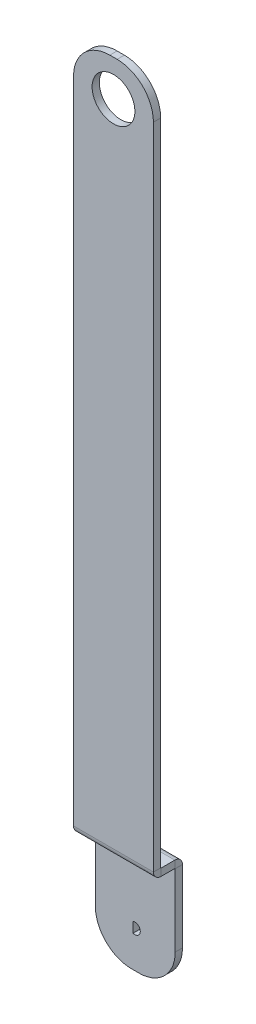
ISO-10303-21;
HEADER;
FILE_DESCRIPTION(('STEP AP214'),'2;1');
FILE_NAME('part.step','',(''),(''),'','','');
FILE_SCHEMA(('AUTOMOTIVE_DESIGN { 1 0 10303 214 1 1 1 1 }'));
ENDSEC;
DATA;
#1=APPLICATION_CONTEXT('core data for automotive mechanical design processes');
#2=APPLICATION_PROTOCOL_DEFINITION('international standard','automotive_design',2000,#1);
#3=PRODUCT_CONTEXT('',#1,'mechanical');
#4=PRODUCT('Part','Part','',(#3));
#5=PRODUCT_RELATED_PRODUCT_CATEGORY('part','',(#4));
#6=PRODUCT_DEFINITION_FORMATION('','',#4);
#7=PRODUCT_DEFINITION_CONTEXT('part definition',#1,'design');
#8=PRODUCT_DEFINITION('design','',#6,#7);
#9=PRODUCT_DEFINITION_SHAPE('','',#8);
#10=(LENGTH_UNIT() NAMED_UNIT(*) SI_UNIT(.MILLI.,.METRE.));
#11=(NAMED_UNIT(*) PLANE_ANGLE_UNIT() SI_UNIT($,.RADIAN.));
#12=(NAMED_UNIT(*) SI_UNIT($,.STERADIAN.) SOLID_ANGLE_UNIT());
#13=UNCERTAINTY_MEASURE_WITH_UNIT(LENGTH_MEASURE(1.E-05),#10,'distance_accuracy_value','');
#14=(GEOMETRIC_REPRESENTATION_CONTEXT(3) GLOBAL_UNCERTAINTY_ASSIGNED_CONTEXT((#13)) GLOBAL_UNIT_ASSIGNED_CONTEXT((#10,
#11,#12)) REPRESENTATION_CONTEXT('',''));
#15=CARTESIAN_POINT('',(0.,0.,0.));
#16=DIRECTION('',(0.,0.,1.));
#17=DIRECTION('',(1.,0.,0.));
#18=AXIS2_PLACEMENT_3D('',#15,#16,#17);
#19=CARTESIAN_POINT('',(-132.999999999779,-143.854999999984,0.0450000000203783));
#20=DIRECTION('',(1.,1.53185103490827E-12,1.85314263934089E-12));
#21=DIRECTION('',(1.53185103490827E-12,-1.,0.));
#22=AXIS2_PLACEMENT_3D('',#19,#20,#21);
#23=PLANE('',#22);
#24=DIRECTION('',(1.53185103490827E-12,-1.,0.));
#25=VECTOR('',#24,1.);
#26=CARTESIAN_POINT('',(-132.999999999779,-143.854999999984,0.0450000000203783));
#27=LINE('',#26,#25);
#28=CARTESIAN_POINT('',(-132.999999999779,-143.854999999984,0.0450000000203783));
#29=VERTEX_POINT('',#28);
#30=CARTESIAN_POINT('',(-132.999999999776,-145.854999999984,0.0450000000203783));
#31=VERTEX_POINT('',#30);
#32=EDGE_CURVE('E295',#29,#31,#27,.T.);
#33=ORIENTED_EDGE('',*,*,#32,.F.);
#34=CARTESIAN_POINT('',(-132.99999999978,-143.754999999984,0.0450000000203783));
#35=DIRECTION('',(-1.,-1.53185103490827E-12,-1.85314263934089E-12));
#36=DIRECTION('',(-1.53185103490827E-12,1.,0.));
#37=AXIS2_PLACEMENT_3D('',#34,#35,#36);
#38=CIRCLE('',#37,0.1);
#39=CARTESIAN_POINT('',(-132.99999999978,-143.754999999984,0.145000000020378));
#40=VERTEX_POINT('',#39);
#41=EDGE_CURVE('E201',#40,#29,#38,.F.);
#42=ORIENTED_EDGE('',*,*,#41,.F.);
#43=DIRECTION('',(1.85314263934081E-12,0.,-1.));
#44=VECTOR('',#43,1.);
#45=CARTESIAN_POINT('',(-132.999999999783,-143.754999999984,2.14500000002038));
#46=LINE('',#45,#44);
#47=CARTESIAN_POINT('',(-132.999999999783,-143.754999999984,2.14500000002038));
#48=VERTEX_POINT('',#47);
#49=EDGE_CURVE('E292',#48,#40,#46,.T.);
#50=ORIENTED_EDGE('',*,*,#49,.F.);
#51=CARTESIAN_POINT('',(-132.99999999978,-143.754999999984,0.0450000000203783));
#52=DIRECTION('',(1.,1.53185103490827E-12,1.85314263934089E-12));
#53=DIRECTION('',(1.53185103490827E-12,-1.,0.));
#54=AXIS2_PLACEMENT_3D('',#51,#52,#53);
#55=CIRCLE('',#54,2.1);
#56=EDGE_CURVE('E208',#48,#31,#55,.T.);
#57=ORIENTED_EDGE('',*,*,#56,.T.);
#58=EDGE_LOOP('',(#33,#42,#50,#57));
#59=FACE_BOUND('',#58,.T.);
#60=ADVANCED_FACE('F41',(#59),#23,.T.);
#61=CARTESIAN_POINT('',(-132.999999999783,-143.754999999984,2.14500000002038));
#62=DIRECTION('',(1.,1.53185103490827E-12,1.85314263934089E-12));
#63=DIRECTION('',(1.53185103490827E-12,-1.,0.));
#64=AXIS2_PLACEMENT_3D('',#61,#62,#63);
#65=PLANE('',#64);
#66=DIRECTION('',(1.85314263934089E-12,0.,-1.));
#67=VECTOR('',#66,1.);
#68=CARTESIAN_POINT('',(-132.99999999978,-143.854999999984,0.145000000020378));
#69=LINE('',#68,#67);
#70=CARTESIAN_POINT('',(-132.999999999772,-143.854999999984,-3.75499999997962));
#71=VERTEX_POINT('',#70);
#72=EDGE_CURVE('E198',#29,#71,#69,.T.);
#73=ORIENTED_EDGE('',*,*,#72,.F.);
#74=ORIENTED_EDGE('',*,*,#32,.T.);
#75=DIRECTION('',(1.85314263934089E-12,0.,-1.));
#76=VECTOR('',#75,1.);
#77=CARTESIAN_POINT('',(-132.999999999777,-145.854999999984,0.145000000020378));
#78=LINE('',#77,#76);
#79=CARTESIAN_POINT('',(-132.999999999769,-145.854999999984,-3.75499999997962));
#80=VERTEX_POINT('',#79);
#81=EDGE_CURVE('E211',#31,#80,#78,.T.);
#82=ORIENTED_EDGE('',*,*,#81,.T.);
#83=DIRECTION('',(-1.53185103490827E-12,1.,0.));
#84=VECTOR('',#83,1.);
#85=CARTESIAN_POINT('',(-132.999999999769,-145.854999999984,-3.75499999997962));
#86=LINE('',#85,#84);
#87=EDGE_CURVE('E283',#80,#71,#86,.T.);
#88=ORIENTED_EDGE('',*,*,#87,.T.);
#89=EDGE_LOOP('',(#73,#74,#82,#88));
#90=FACE_BOUND('',#89,.T.);
#91=ADVANCED_FACE('F370',(#90),#65,.T.);
#92=CARTESIAN_POINT('',(-154.99999999978,-143.755000000017,0.144999999979609));
#93=DIRECTION('',(-1.,-1.53185103490827E-12,-1.85314263934089E-12));
#94=DIRECTION('',(-1.53185103490827E-12,1.,0.));
#95=AXIS2_PLACEMENT_3D('',#92,#93,#94);
#96=PLANE('',#95);
#97=DIRECTION('',(-1.85314263934081E-12,0.,1.));
#98=VECTOR('',#97,1.);
#99=CARTESIAN_POINT('',(-154.99999999978,-143.755000000017,0.144999999979609));
#100=LINE('',#99,#98);
#101=CARTESIAN_POINT('',(-154.99999999978,-143.755000000017,0.144999999979609));
#102=VERTEX_POINT('',#101);
#103=CARTESIAN_POINT('',(-154.999999999784,-143.755000000018,2.14499999997961));
#104=VERTEX_POINT('',#103);
#105=EDGE_CURVE('E289',#102,#104,#100,.T.);
#106=ORIENTED_EDGE('',*,*,#105,.F.);
#107=CARTESIAN_POINT('',(-154.99999999978,-143.755000000017,0.0449999999796092));
#108=DIRECTION('',(-1.,-1.53185103490827E-12,-1.85314263934089E-12));
#109=DIRECTION('',(-1.53185103490827E-12,1.,0.));
#110=AXIS2_PLACEMENT_3D('',#107,#108,#109);
#111=CIRCLE('',#110,0.1);
#112=CARTESIAN_POINT('',(-154.999999999779,-143.855000000017,0.0449999999796092));
#113=VERTEX_POINT('',#112);
#114=EDGE_CURVE('E229',#102,#113,#111,.F.);
#115=ORIENTED_EDGE('',*,*,#114,.T.);
#116=DIRECTION('',(-1.53185103490827E-12,1.,0.));
#117=VECTOR('',#116,1.);
#118=CARTESIAN_POINT('',(-154.999999999776,-145.855000000017,0.0449999999796092));
#119=LINE('',#118,#117);
#120=CARTESIAN_POINT('',(-154.999999999776,-145.855000000017,0.0449999999796092));
#121=VERTEX_POINT('',#120);
#122=EDGE_CURVE('E287',#121,#113,#119,.T.);
#123=ORIENTED_EDGE('',*,*,#122,.F.);
#124=CARTESIAN_POINT('',(-154.99999999978,-143.755000000017,0.0449999999796092));
#125=DIRECTION('',(1.,1.53185103490827E-12,1.85314263934089E-12));
#126=DIRECTION('',(1.53185103490827E-12,-1.,0.));
#127=AXIS2_PLACEMENT_3D('',#124,#125,#126);
#128=CIRCLE('',#127,2.1);
#129=EDGE_CURVE('E236',#104,#121,#128,.T.);
#130=ORIENTED_EDGE('',*,*,#129,.F.);
#131=EDGE_LOOP('',(#106,#115,#123,#130));
#132=FACE_BOUND('',#131,.T.);
#133=ADVANCED_FACE('F428',(#132),#96,.T.);
#134=CARTESIAN_POINT('',(-154.999999999776,-145.855000000017,0.0449999999796092));
#135=DIRECTION('',(-1.,-1.53185103490827E-12,-1.85314263934089E-12));
#136=DIRECTION('',(-1.53185103490827E-12,1.,0.));
#137=AXIS2_PLACEMENT_3D('',#134,#135,#136);
#138=PLANE('',#137);
#139=DIRECTION('',(1.53185103490827E-12,-1.,0.));
#140=VECTOR('',#139,1.);
#141=CARTESIAN_POINT('',(-155.000000000073,45.1449999999826,2.14499999997961));
#142=LINE('',#141,#140);
#143=CARTESIAN_POINT('',(-155.000000000058,35.1449999999826,2.14499999997961));
#144=VERTEX_POINT('',#143);
#145=EDGE_CURVE('E234',#144,#104,#142,.T.);
#146=ORIENTED_EDGE('',*,*,#145,.F.);
#147=DIRECTION('',(1.85314263934089E-12,0.,-1.));
#148=VECTOR('',#147,1.);
#149=CARTESIAN_POINT('',(-155.000000000054,35.1449999999826,0.0449999999796092));
#150=LINE('',#149,#148);
#151=CARTESIAN_POINT('',(-155.000000000054,35.1449999999826,0.144999999979609));
#152=VERTEX_POINT('',#151);
#153=EDGE_CURVE('E315',#144,#152,#150,.T.);
#154=ORIENTED_EDGE('',*,*,#153,.T.);
#155=DIRECTION('',(1.53185103490827E-12,-1.,0.));
#156=VECTOR('',#155,1.);
#157=CARTESIAN_POINT('',(-155.000000000069,45.1449999999826,0.144999999979609));
#158=LINE('',#157,#156);
#159=EDGE_CURVE('E232',#152,#102,#158,.T.);
#160=ORIENTED_EDGE('',*,*,#159,.T.);
#161=ORIENTED_EDGE('',*,*,#105,.T.);
#162=EDGE_LOOP('',(#146,#154,#160,#161));
#163=FACE_BOUND('',#162,.T.);
#164=ADVANCED_FACE('F338',(#163),#138,.T.);
#165=CARTESIAN_POINT('',(-132.999999999765,-145.954999999984,-5.85499999997962));
#166=DIRECTION('',(1.,1.53185103490827E-12,1.85314263934089E-12));
#167=DIRECTION('',(1.53185103490827E-12,-1.,0.));
#168=AXIS2_PLACEMENT_3D('',#165,#166,#167);
#169=PLANE('',#168);
#170=DIRECTION('',(-1.85314263934089E-12,0.,1.));
#171=VECTOR('',#170,1.);
#172=CARTESIAN_POINT('',(-132.999999999765,-145.954999999984,-5.85499999997962));
#173=LINE('',#172,#171);
#174=CARTESIAN_POINT('',(-132.999999999765,-145.954999999984,-5.85499999997962));
#175=VERTEX_POINT('',#174);
#176=CARTESIAN_POINT('',(-132.999999999769,-145.954999999984,-3.85499999997962));
#177=VERTEX_POINT('',#176);
#178=EDGE_CURVE('E285',#175,#177,#173,.T.);
#179=ORIENTED_EDGE('',*,*,#178,.F.);
#180=CARTESIAN_POINT('',(-132.999999999769,-145.954999999984,-3.75499999997962));
#181=DIRECTION('',(1.,1.53185103490827E-12,1.85314263934089E-12));
#182=DIRECTION('',(1.53185103490827E-12,-1.,0.));
#183=AXIS2_PLACEMENT_3D('',#180,#181,#182);
#184=CIRCLE('',#183,2.1);
#185=EDGE_CURVE('E195',#71,#175,#184,.F.);
#186=ORIENTED_EDGE('',*,*,#185,.F.);
#187=ORIENTED_EDGE('',*,*,#87,.F.);
#188=CARTESIAN_POINT('',(-132.999999999769,-145.954999999984,-3.75499999997962));
#189=DIRECTION('',(1.,1.53185103490827E-12,1.85314263934089E-12));
#190=DIRECTION('',(1.53185103490827E-12,-1.,0.));
#191=AXIS2_PLACEMENT_3D('',#188,#189,#190);
#192=CIRCLE('',#191,0.0999999999999998);
#193=EDGE_CURVE('E214',#80,#177,#192,.F.);
#194=ORIENTED_EDGE('',*,*,#193,.T.);
#195=EDGE_LOOP('',(#179,#186,#187,#194));
#196=FACE_BOUND('',#195,.T.);
#197=ADVANCED_FACE('F379',(#196),#169,.T.);
#198=CARTESIAN_POINT('',(-132.999999999769,-145.854999999984,-3.75499999997962));
#199=DIRECTION('',(1.,1.53185103490827E-12,1.85314263934089E-12));
#200=DIRECTION('',(1.53185103490827E-12,-1.,0.));
#201=AXIS2_PLACEMENT_3D('',#198,#199,#200);
#202=PLANE('',#201);
#203=DIRECTION('',(1.53185103490827E-12,-1.,0.));
#204=VECTOR('',#203,1.);
#205=CARTESIAN_POINT('',(-132.999999999772,-143.854999999984,-3.85499999997962));
#206=LINE('',#205,#204);
#207=CARTESIAN_POINT('',(-132.999999999739,-165.854999999984,-3.85499999997962));
#208=VERTEX_POINT('',#207);
#209=EDGE_CURVE('E188',#177,#208,#206,.T.);
#210=ORIENTED_EDGE('',*,*,#209,.T.);
#211=DIRECTION('',(-1.85314263934089E-12,0.,1.));
#212=VECTOR('',#211,1.);
#213=CARTESIAN_POINT('',(-132.999999999739,-165.854999999984,-3.75499999997962));
#214=LINE('',#213,#212);
#215=CARTESIAN_POINT('',(-132.999999999735,-165.854999999984,-5.85499999997962));
#216=VERTEX_POINT('',#215);
#217=EDGE_CURVE('E306',#208,#216,#214,.F.);
#218=ORIENTED_EDGE('',*,*,#217,.T.);
#219=DIRECTION('',(1.53185103490827E-12,-1.,0.));
#220=VECTOR('',#219,1.);
#221=CARTESIAN_POINT('',(-132.999999999769,-143.854999999984,-5.85499999997962));
#222=LINE('',#221,#220);
#223=EDGE_CURVE('E191',#175,#216,#222,.T.);
#224=ORIENTED_EDGE('',*,*,#223,.F.);
#225=ORIENTED_EDGE('',*,*,#178,.T.);
#226=EDGE_LOOP('',(#210,#218,#224,#225));
#227=FACE_BOUND('',#226,.T.);
#228=ADVANCED_FACE('F387',(#227),#202,.T.);
#229=CARTESIAN_POINT('',(-154.999999999772,-143.855000000017,-3.75500000002039));
#230=DIRECTION('',(-1.,-1.53185103490827E-12,-1.85314263934089E-12));
#231=DIRECTION('',(-1.53185103490827E-12,1.,0.));
#232=AXIS2_PLACEMENT_3D('',#229,#230,#231);
#233=PLANE('',#232);
#234=DIRECTION('',(1.53185103490827E-12,-1.,0.));
#235=VECTOR('',#234,1.);
#236=CARTESIAN_POINT('',(-154.999999999772,-143.855000000017,-3.75500000002039));
#237=LINE('',#236,#235);
#238=CARTESIAN_POINT('',(-154.999999999772,-143.855000000017,-3.75500000002039));
#239=VERTEX_POINT('',#238);
#240=CARTESIAN_POINT('',(-154.999999999769,-145.855000000017,-3.75500000002039));
#241=VERTEX_POINT('',#240);
#242=EDGE_CURVE('E281',#239,#241,#237,.T.);
#243=ORIENTED_EDGE('',*,*,#242,.F.);
#244=CARTESIAN_POINT('',(-154.999999999769,-145.955000000017,-3.75500000002039));
#245=DIRECTION('',(1.,1.53185103490827E-12,1.85314263934089E-12));
#246=DIRECTION('',(1.53185103490827E-12,-1.,0.));
#247=AXIS2_PLACEMENT_3D('',#244,#245,#246);
#248=CIRCLE('',#247,2.1);
#249=CARTESIAN_POINT('',(-154.999999999765,-145.955000000017,-5.85500000002039));
#250=VERTEX_POINT('',#249);
#251=EDGE_CURVE('E223',#239,#250,#248,.F.);
#252=ORIENTED_EDGE('',*,*,#251,.T.);
#253=DIRECTION('',(1.85314263934089E-12,0.,-1.));
#254=VECTOR('',#253,1.);
#255=CARTESIAN_POINT('',(-154.999999999769,-145.955000000017,-3.85500000002039));
#256=LINE('',#255,#254);
#257=CARTESIAN_POINT('',(-154.999999999769,-145.955000000017,-3.85500000002039));
#258=VERTEX_POINT('',#257);
#259=EDGE_CURVE('E279',#258,#250,#256,.T.);
#260=ORIENTED_EDGE('',*,*,#259,.F.);
#261=CARTESIAN_POINT('',(-154.999999999769,-145.955000000017,-3.75500000002039));
#262=DIRECTION('',(1.,1.53185103490827E-12,1.85314263934089E-12));
#263=DIRECTION('',(1.53185103490827E-12,-1.,0.));
#264=AXIS2_PLACEMENT_3D('',#261,#262,#263);
#265=CIRCLE('',#264,0.0999999999999998);
#266=EDGE_CURVE('E192',#241,#258,#265,.F.);
#267=ORIENTED_EDGE('',*,*,#266,.F.);
#268=EDGE_LOOP('',(#243,#252,#260,#267));
#269=FACE_BOUND('',#268,.T.);
#270=ADVANCED_FACE('F407',(#269),#233,.T.);
#271=CARTESIAN_POINT('',(-154.999999999769,-145.955000000017,-3.85500000002039));
#272=DIRECTION('',(-1.,-1.53185103490827E-12,-1.85314263934089E-12));
#273=DIRECTION('',(-1.53185103490827E-12,1.,0.));
#274=AXIS2_PLACEMENT_3D('',#271,#272,#273);
#275=PLANE('',#274);
#276=DIRECTION('',(1.85314263934089E-12,0.,-1.));
#277=VECTOR('',#276,1.);
#278=CARTESIAN_POINT('',(-154.99999999978,-143.855000000017,0.144999999979609));
#279=LINE('',#278,#277);
#280=EDGE_CURVE('E226',#113,#239,#279,.T.);
#281=ORIENTED_EDGE('',*,*,#280,.T.);
#282=ORIENTED_EDGE('',*,*,#242,.T.);
#283=DIRECTION('',(1.85314263934089E-12,0.,-1.));
#284=VECTOR('',#283,1.);
#285=CARTESIAN_POINT('',(-154.999999999777,-145.855000000017,0.144999999979609));
#286=LINE('',#285,#284);
#287=EDGE_CURVE('E239',#121,#241,#286,.T.);
#288=ORIENTED_EDGE('',*,*,#287,.F.);
#289=ORIENTED_EDGE('',*,*,#122,.T.);
#290=EDGE_LOOP('',(#281,#282,#288,#289));
#291=FACE_BOUND('',#290,.T.);
#292=ADVANCED_FACE('F413',(#291),#275,.T.);
#293=CARTESIAN_POINT('',(-132.999999999772,-143.854999999984,-3.85499999997962));
#294=DIRECTION('',(1.85314263934089E-12,0.,-1.));
#295=DIRECTION('',(1.,1.53185103490827E-12,1.85314263934089E-12));
#296=AXIS2_PLACEMENT_3D('',#293,#294,#295);
#297=PLANE('',#296);
#298=DIRECTION('',(-1.53185103490827E-12,1.,0.));
#299=VECTOR('',#298,1.);
#300=CARTESIAN_POINT('',(-144.616566495482,-143.855000000002,-3.85500000000115));
#301=LINE('',#300,#299);
#302=CARTESIAN_POINT('',(-144.616566495447,-167.152240304964,-3.85500000000115));
#303=VERTEX_POINT('',#302);
#304=CARTESIAN_POINT('',(-144.616566495451,-164.323813180218,-3.85500000000115));
#305=VERTEX_POINT('',#304);
#306=EDGE_CURVE('E184',#303,#305,#301,.T.);
#307=ORIENTED_EDGE('',*,*,#306,.T.);
#308=CARTESIAN_POINT('',(-144.116566495449,-165.73802674259,-3.85500000000022));
#309=DIRECTION('',(1.85314263934089E-12,0.,-1.));
#310=DIRECTION('',(1.,1.53185103490827E-12,1.85314263934089E-12));
#311=AXIS2_PLACEMENT_3D('',#308,#309,#310);
#312=CIRCLE('',#311,1.5);
#313=EDGE_CURVE('E165',#305,#303,#312,.T.);
#314=ORIENTED_EDGE('',*,*,#313,.T.);
#315=EDGE_LOOP('',(#307,#314));
#316=FACE_BOUND('',#315,.T.);
#317=DIRECTION('',(-1.,-1.53185103490827E-12,-1.85314263934089E-12));
#318=VECTOR('',#317,1.);
#319=CARTESIAN_POINT('',(-132.999999999723,-175.854999999984,-3.85499999997962));
#320=LINE('',#319,#318);
#321=CARTESIAN_POINT('',(-142.999999999723,-175.854999999999,-3.85499999999815));
#322=VERTEX_POINT('',#321);
#323=CARTESIAN_POINT('',(-144.999999999723,-175.855000000002,-3.85500000000186));
#324=VERTEX_POINT('',#323);
#325=EDGE_CURVE('E276',#322,#324,#320,.T.);
#326=ORIENTED_EDGE('',*,*,#325,.F.);
#327=CARTESIAN_POINT('',(-142.999999999739,-165.854999999999,-3.85499999999815));
#328=DIRECTION('',(1.85314263934089E-12,0.,-1.));
#329=DIRECTION('',(1.,1.53185103490827E-12,1.85314263934089E-12));
#330=AXIS2_PLACEMENT_3D('',#327,#328,#329);
#331=CIRCLE('',#330,10.);
#332=EDGE_CURVE('E304',#322,#208,#331,.F.);
#333=ORIENTED_EDGE('',*,*,#332,.T.);
#334=ORIENTED_EDGE('',*,*,#209,.F.);
#335=DIRECTION('',(-1.,-1.53185103490827E-12,-1.85314263934089E-12));
#336=VECTOR('',#335,1.);
#337=CARTESIAN_POINT('',(-132.999999999769,-145.954999999984,-3.85499999997962));
#338=LINE('',#337,#336);
#339=EDGE_CURVE('E217',#177,#258,#338,.T.);
#340=ORIENTED_EDGE('',*,*,#339,.T.);
#341=DIRECTION('',(1.53185103490827E-12,-1.,0.));
#342=VECTOR('',#341,1.);
#343=CARTESIAN_POINT('',(-154.999999999772,-143.855000000017,-3.85500000002039));
#344=LINE('',#343,#342);
#345=CARTESIAN_POINT('',(-154.999999999739,-165.855000000017,-3.85500000002039));
#346=VERTEX_POINT('',#345);
#347=EDGE_CURVE('E187',#258,#346,#344,.T.);
#348=ORIENTED_EDGE('',*,*,#347,.T.);
#349=CARTESIAN_POINT('',(-144.999999999739,-165.855000000002,-3.85500000000186));
#350=DIRECTION('',(1.85314263934089E-12,0.,-1.));
#351=DIRECTION('',(1.,1.53185103490827E-12,1.85314263934089E-12));
#352=AXIS2_PLACEMENT_3D('',#349,#350,#351);
#353=CIRCLE('',#352,10.);
#354=EDGE_CURVE('E302',#346,#324,#353,.F.);
#355=ORIENTED_EDGE('',*,*,#354,.T.);
#356=EDGE_LOOP('',(#326,#333,#334,#340,#348,#355));
#357=FACE_BOUND('',#356,.T.);
#358=ADVANCED_FACE('F411',(#316,#357),#297,.F.);
#359=CARTESIAN_POINT('',(-132.99999999972,-175.854999999984,-5.85499999997962));
#360=DIRECTION('',(1.53185103490827E-12,-1.,0.));
#361=DIRECTION('',(-1.,-1.53185103490827E-12,-1.85314263934089E-12));
#362=AXIS2_PLACEMENT_3D('',#359,#360,#361);
#363=PLANE('',#362);
#364=DIRECTION('',(-1.,-1.53185103490827E-12,-1.85314263934089E-12));
#365=VECTOR('',#364,1.);
#366=CARTESIAN_POINT('',(-132.99999999972,-175.854999999984,-5.85499999997962));
#367=LINE('',#366,#365);
#368=CARTESIAN_POINT('',(-142.999999999719,-175.854999999999,-5.85499999999815));
#369=VERTEX_POINT('',#368);
#370=CARTESIAN_POINT('',(-144.99999999972,-175.855000000002,-5.85500000000186));
#371=VERTEX_POINT('',#370);
#372=EDGE_CURVE('E273',#369,#371,#367,.T.);
#373=ORIENTED_EDGE('',*,*,#372,.F.);
#374=DIRECTION('',(-1.85314263934089E-12,0.,1.));
#375=VECTOR('',#374,1.);
#376=CARTESIAN_POINT('',(-142.999999999719,-175.854999999999,-5.85499999999815));
#377=LINE('',#376,#375);
#378=EDGE_CURVE('E299',#369,#322,#377,.T.);
#379=ORIENTED_EDGE('',*,*,#378,.T.);
#380=ORIENTED_EDGE('',*,*,#325,.T.);
#381=DIRECTION('',(-1.85314263934089E-12,0.,1.));
#382=VECTOR('',#381,1.);
#383=CARTESIAN_POINT('',(-144.99999999972,-175.855000000002,-5.85500000000186));
#384=LINE('',#383,#382);
#385=EDGE_CURVE('E297',#324,#371,#384,.F.);
#386=ORIENTED_EDGE('',*,*,#385,.T.);
#387=EDGE_LOOP('',(#373,#379,#380,#386));
#388=FACE_BOUND('',#387,.T.);
#389=ADVANCED_FACE('F396',(#388),#363,.T.);
#390=CARTESIAN_POINT('',(-132.999999999769,-143.854999999984,-5.85499999997962));
#391=DIRECTION('',(1.85314263934089E-12,0.,-1.));
#392=DIRECTION('',(1.,1.53185103490827E-12,1.85314263934089E-12));
#393=AXIS2_PLACEMENT_3D('',#390,#391,#392);
#394=PLANE('',#393);
#395=CARTESIAN_POINT('',(-144.116566495445,-165.73802674259,-5.85500000000022));
#396=DIRECTION('',(1.85314263934089E-12,0.,-1.));
#397=DIRECTION('',(1.,1.53185103490827E-12,1.85314263934089E-12));
#398=AXIS2_PLACEMENT_3D('',#395,#396,#397);
#399=CIRCLE('',#398,1.5);
#400=CARTESIAN_POINT('',(-144.616566495447,-164.323813180218,-5.85500000000115));
#401=VERTEX_POINT('',#400);
#402=CARTESIAN_POINT('',(-144.616566495443,-167.152240304964,-5.85500000000115));
#403=VERTEX_POINT('',#402);
#404=EDGE_CURVE('E63',#401,#403,#399,.T.);
#405=ORIENTED_EDGE('',*,*,#404,.F.);
#406=DIRECTION('',(-1.53185103490827E-12,1.,0.));
#407=VECTOR('',#406,1.);
#408=CARTESIAN_POINT('',(-144.616566495447,-164.323813180218,-5.85500000000115));
#409=LINE('',#408,#407);
#410=EDGE_CURVE('E171',#403,#401,#409,.T.);
#411=ORIENTED_EDGE('',*,*,#410,.F.);
#412=EDGE_LOOP('',(#405,#411));
#413=FACE_BOUND('',#412,.T.);
#414=ORIENTED_EDGE('',*,*,#223,.T.);
#415=CARTESIAN_POINT('',(-142.999999999735,-165.854999999999,-5.85499999999815));
#416=DIRECTION('',(1.85314263934089E-12,0.,-1.));
#417=DIRECTION('',(1.,1.53185103490827E-12,1.85314263934089E-12));
#418=AXIS2_PLACEMENT_3D('',#415,#416,#417);
#419=CIRCLE('',#418,10.);
#420=EDGE_CURVE('E310',#216,#369,#419,.T.);
#421=ORIENTED_EDGE('',*,*,#420,.T.);
#422=ORIENTED_EDGE('',*,*,#372,.T.);
#423=CARTESIAN_POINT('',(-144.999999999735,-165.855000000002,-5.85500000000186));
#424=DIRECTION('',(1.85314263934089E-12,0.,-1.));
#425=DIRECTION('',(1.,1.53185103490827E-12,1.85314263934089E-12));
#426=AXIS2_PLACEMENT_3D('',#423,#424,#425);
#427=CIRCLE('',#426,10.);
#428=CARTESIAN_POINT('',(-154.999999999735,-165.855000000017,-5.85500000002039));
#429=VERTEX_POINT('',#428);
#430=EDGE_CURVE('E308',#371,#429,#427,.T.);
#431=ORIENTED_EDGE('',*,*,#430,.T.);
#432=DIRECTION('',(1.53185103490827E-12,-1.,0.));
#433=VECTOR('',#432,1.);
#434=CARTESIAN_POINT('',(-154.999999999769,-143.855000000017,-5.85500000002039));
#435=LINE('',#434,#433);
#436=EDGE_CURVE('E220',#250,#429,#435,.T.);
#437=ORIENTED_EDGE('',*,*,#436,.F.);
#438=DIRECTION('',(-1.,-1.53185103490827E-12,-1.85314263934089E-12));
#439=VECTOR('',#438,1.);
#440=CARTESIAN_POINT('',(-132.999999999765,-145.954999999984,-5.85499999997962));
#441=LINE('',#440,#439);
#442=EDGE_CURVE('E270',#175,#250,#441,.T.);
#443=ORIENTED_EDGE('',*,*,#442,.F.);
#444=EDGE_LOOP('',(#414,#421,#422,#431,#437,#443));
#445=FACE_BOUND('',#444,.T.);
#446=ADVANCED_FACE('F175',(#413,#445),#394,.T.);
#447=CARTESIAN_POINT('',(-132.999999999769,-145.954999999984,-3.75499999997962));
#448=DIRECTION('',(-1.,-1.53185103490827E-12,-1.85314263934089E-12));
#449=DIRECTION('',(-1.53185103490827E-12,1.,0.));
#450=AXIS2_PLACEMENT_3D('',#447,#448,#449);
#451=CYLINDRICAL_SURFACE('',#450,2.1);
#452=ORIENTED_EDGE('',*,*,#251,.F.);
#453=DIRECTION('',(-1.,-1.53185103490827E-12,-1.85314263934089E-12));
#454=VECTOR('',#453,1.);
#455=CARTESIAN_POINT('',(-132.999999999772,-143.854999999984,-3.75499999997962));
#456=LINE('',#455,#454);
#457=EDGE_CURVE('E267',#71,#239,#456,.T.);
#458=ORIENTED_EDGE('',*,*,#457,.F.);
#459=ORIENTED_EDGE('',*,*,#185,.T.);
#460=ORIENTED_EDGE('',*,*,#442,.T.);
#461=EDGE_LOOP('',(#452,#458,#459,#460));
#462=FACE_BOUND('',#461,.T.);
#463=ADVANCED_FACE('F378',(#462),#451,.T.);
#464=CARTESIAN_POINT('',(-132.99999999978,-143.854999999984,0.145000000020378));
#465=DIRECTION('',(-1.53185103490827E-12,1.,0.));
#466=DIRECTION('',(1.,1.53185103490827E-12,1.85314263934089E-12));
#467=AXIS2_PLACEMENT_3D('',#464,#465,#466);
#468=PLANE('',#467);
#469=ORIENTED_EDGE('',*,*,#280,.F.);
#470=DIRECTION('',(-1.,-1.53185103490827E-12,-1.85314263934089E-12));
#471=VECTOR('',#470,1.);
#472=CARTESIAN_POINT('',(-132.999999999779,-143.854999999984,0.0450000000203783));
#473=LINE('',#472,#471);
#474=EDGE_CURVE('E264',#29,#113,#473,.T.);
#475=ORIENTED_EDGE('',*,*,#474,.F.);
#476=ORIENTED_EDGE('',*,*,#72,.T.);
#477=ORIENTED_EDGE('',*,*,#457,.T.);
#478=EDGE_LOOP('',(#469,#475,#476,#477));
#479=FACE_BOUND('',#478,.T.);
#480=ADVANCED_FACE('F369',(#479),#468,.T.);
#481=CARTESIAN_POINT('',(-132.99999999978,-143.754999999984,0.0450000000203783));
#482=DIRECTION('',(-1.,-1.53185103490827E-12,-1.85314263934089E-12));
#483=DIRECTION('',(-1.53185103490827E-12,1.,0.));
#484=AXIS2_PLACEMENT_3D('',#481,#482,#483);
#485=CYLINDRICAL_SURFACE('',#484,0.1);
#486=ORIENTED_EDGE('',*,*,#114,.F.);
#487=DIRECTION('',(-1.,-1.53185103490827E-12,-1.85314263934089E-12));
#488=VECTOR('',#487,1.);
#489=CARTESIAN_POINT('',(-132.99999999978,-143.754999999984,0.145000000020378));
#490=LINE('',#489,#488);
#491=EDGE_CURVE('E261',#40,#102,#490,.T.);
#492=ORIENTED_EDGE('',*,*,#491,.F.);
#493=ORIENTED_EDGE('',*,*,#41,.T.);
#494=ORIENTED_EDGE('',*,*,#474,.T.);
#495=EDGE_LOOP('',(#486,#492,#493,#494));
#496=FACE_BOUND('',#495,.T.);
#497=ADVANCED_FACE('F361',(#496),#485,.F.);
#498=CARTESIAN_POINT('',(-133.000000000069,45.1450000000163,0.145000000020378));
#499=DIRECTION('',(1.85314263934089E-12,0.,-1.));
#500=DIRECTION('',(1.,1.53185103490827E-12,1.85314263934089E-12));
#501=AXIS2_PLACEMENT_3D('',#498,#499,#500);
#502=PLANE('',#501);
#503=CARTESIAN_POINT('',(-144.000000000054,35.1449999999994,0.144999999999994));
#504=DIRECTION('',(1.85314263934089E-12,0.,-1.));
#505=DIRECTION('',(1.,1.53185103490827E-12,1.85314263934089E-12));
#506=AXIS2_PLACEMENT_3D('',#503,#504,#505);
#507=CIRCLE('',#506,5.89418421464922);
#508=CARTESIAN_POINT('',(-138.105815785405,35.1450000000084,0.145000000010917));
#509=VERTEX_POINT('',#508);
#510=EDGE_CURVE('E181',#509,#509,#507,.T.);
#511=ORIENTED_EDGE('',*,*,#510,.F.);
#512=EDGE_LOOP('',(#511));
#513=FACE_BOUND('',#512,.T.);
#514=ORIENTED_EDGE('',*,*,#159,.F.);
#515=CARTESIAN_POINT('',(-145.000000000054,35.1449999999979,0.144999999998141));
#516=DIRECTION('',(1.85314263934089E-12,0.,-1.));
#517=DIRECTION('',(1.,1.53185103490827E-12,1.85314263934089E-12));
#518=AXIS2_PLACEMENT_3D('',#515,#516,#517);
#519=CIRCLE('',#518,10.);
#520=CARTESIAN_POINT('',(-145.000000000069,45.1449999999979,0.144999999998141));
#521=VERTEX_POINT('',#520);
#522=EDGE_CURVE('E320',#152,#521,#519,.T.);
#523=ORIENTED_EDGE('',*,*,#522,.T.);
#524=DIRECTION('',(-1.,-1.53185103490827E-12,-1.85314263934089E-12));
#525=VECTOR('',#524,1.);
#526=CARTESIAN_POINT('',(-133.000000000069,45.1450000000163,0.145000000020378));
#527=LINE('',#526,#525);
#528=CARTESIAN_POINT('',(-143.000000000069,45.145000000001,0.145000000001847));
#529=VERTEX_POINT('',#528);
#530=EDGE_CURVE('E258',#529,#521,#527,.T.);
#531=ORIENTED_EDGE('',*,*,#530,.F.);
#532=CARTESIAN_POINT('',(-143.000000000054,35.1450000000009,0.145000000001847));
#533=DIRECTION('',(1.85314263934089E-12,0.,-1.));
#534=DIRECTION('',(1.,1.53185103490827E-12,1.85314263934089E-12));
#535=AXIS2_PLACEMENT_3D('',#532,#533,#534);
#536=CIRCLE('',#535,10.);
#537=CARTESIAN_POINT('',(-133.000000000054,35.1450000000162,0.145000000020378));
#538=VERTEX_POINT('',#537);
#539=EDGE_CURVE('E318',#529,#538,#536,.T.);
#540=ORIENTED_EDGE('',*,*,#539,.T.);
#541=DIRECTION('',(1.53185103490827E-12,-1.,0.));
#542=VECTOR('',#541,1.);
#543=CARTESIAN_POINT('',(-133.000000000069,45.1450000000163,0.145000000020378));
#544=LINE('',#543,#542);
#545=EDGE_CURVE('E204',#538,#40,#544,.T.);
#546=ORIENTED_EDGE('',*,*,#545,.T.);
#547=ORIENTED_EDGE('',*,*,#491,.T.);
#548=EDGE_LOOP('',(#514,#523,#531,#540,#546,#547));
#549=FACE_BOUND('',#548,.T.);
#550=ADVANCED_FACE('F344',(#513,#549),#502,.T.);
#551=CARTESIAN_POINT('',(-133.000000000073,45.1450000000163,2.14500000002038));
#552=DIRECTION('',(-1.53185103490827E-12,1.,0.));
#553=DIRECTION('',(1.,1.53185103490827E-12,1.85314263934089E-12));
#554=AXIS2_PLACEMENT_3D('',#551,#552,#553);
#555=PLANE('',#554);
#556=ORIENTED_EDGE('',*,*,#530,.T.);
#557=DIRECTION('',(1.85314263934089E-12,0.,-1.));
#558=VECTOR('',#557,1.);
#559=CARTESIAN_POINT('',(-145.000000000073,45.1449999999979,2.14499999999814));
#560=LINE('',#559,#558);
#561=CARTESIAN_POINT('',(-145.000000000073,45.1449999999979,2.14499999999814));
#562=VERTEX_POINT('',#561);
#563=EDGE_CURVE('E325',#521,#562,#560,.F.);
#564=ORIENTED_EDGE('',*,*,#563,.T.);
#565=DIRECTION('',(-1.,-1.53185103490827E-12,-1.85314263934089E-12));
#566=VECTOR('',#565,1.);
#567=CARTESIAN_POINT('',(-133.000000000073,45.1450000000163,2.14500000002038));
#568=LINE('',#567,#566);
#569=CARTESIAN_POINT('',(-143.000000000073,45.145000000001,2.14500000000185));
#570=VERTEX_POINT('',#569);
#571=EDGE_CURVE('E255',#570,#562,#568,.T.);
#572=ORIENTED_EDGE('',*,*,#571,.F.);
#573=DIRECTION('',(1.85314263934089E-12,0.,-1.));
#574=VECTOR('',#573,1.);
#575=CARTESIAN_POINT('',(-143.000000000073,45.145000000001,2.14500000000185));
#576=LINE('',#575,#574);
#577=EDGE_CURVE('E322',#570,#529,#576,.T.);
#578=ORIENTED_EDGE('',*,*,#577,.T.);
#579=EDGE_LOOP('',(#556,#564,#572,#578));
#580=FACE_BOUND('',#579,.T.);
#581=ADVANCED_FACE('F346',(#580),#555,.T.);
#582=CARTESIAN_POINT('',(-133.000000000073,45.1450000000163,2.14500000002038));
#583=DIRECTION('',(1.85314263934089E-12,0.,-1.));
#584=DIRECTION('',(1.,1.53185103490827E-12,1.85314263934089E-12));
#585=AXIS2_PLACEMENT_3D('',#582,#583,#584);
#586=PLANE('',#585);
#587=CARTESIAN_POINT('',(-144.000000000058,35.1449999999994,2.14499999999999));
#588=DIRECTION('',(1.85314263934089E-12,0.,-1.));
#589=DIRECTION('',(1.,1.53185103490827E-12,1.85314263934089E-12));
#590=AXIS2_PLACEMENT_3D('',#587,#588,#589);
#591=CIRCLE('',#590,5.89418421464922);
#592=CARTESIAN_POINT('',(-138.105815785408,35.1450000000084,2.14500000001092));
#593=VERTEX_POINT('',#592);
#594=EDGE_CURVE('E167',#593,#593,#591,.T.);
#595=ORIENTED_EDGE('',*,*,#594,.T.);
#596=EDGE_LOOP('',(#595));
#597=FACE_BOUND('',#596,.T.);
#598=ORIENTED_EDGE('',*,*,#571,.T.);
#599=CARTESIAN_POINT('',(-145.000000000058,35.1449999999979,2.14499999999814));
#600=DIRECTION('',(1.85314263934089E-12,0.,-1.));
#601=DIRECTION('',(1.,1.53185103490827E-12,1.85314263934089E-12));
#602=AXIS2_PLACEMENT_3D('',#599,#600,#601);
#603=CIRCLE('',#602,10.);
#604=EDGE_CURVE('E49',#562,#144,#603,.F.);
#605=ORIENTED_EDGE('',*,*,#604,.T.);
#606=ORIENTED_EDGE('',*,*,#145,.T.);
#607=DIRECTION('',(-1.,-1.53185103490827E-12,-1.85314263934089E-12));
#608=VECTOR('',#607,1.);
#609=CARTESIAN_POINT('',(-132.999999999783,-143.754999999984,2.14500000002038));
#610=LINE('',#609,#608);
#611=EDGE_CURVE('E252',#48,#104,#610,.T.);
#612=ORIENTED_EDGE('',*,*,#611,.F.);
#613=DIRECTION('',(1.53185103490827E-12,-1.,0.));
#614=VECTOR('',#613,1.);
#615=CARTESIAN_POINT('',(-133.000000000073,45.1450000000163,2.14500000002038));
#616=LINE('',#615,#614);
#617=CARTESIAN_POINT('',(-133.000000000058,35.1450000000162,2.14500000002038));
#618=VERTEX_POINT('',#617);
#619=EDGE_CURVE('E206',#618,#48,#616,.T.);
#620=ORIENTED_EDGE('',*,*,#619,.F.);
#621=CARTESIAN_POINT('',(-143.000000000058,35.1450000000009,2.14500000000185));
#622=DIRECTION('',(1.85314263934089E-12,0.,-1.));
#623=DIRECTION('',(1.,1.53185103490827E-12,1.85314263934089E-12));
#624=AXIS2_PLACEMENT_3D('',#621,#622,#623);
#625=CIRCLE('',#624,10.);
#626=EDGE_CURVE('E327',#618,#570,#625,.F.);
#627=ORIENTED_EDGE('',*,*,#626,.T.);
#628=EDGE_LOOP('',(#598,#605,#606,#612,#620,#627));
#629=FACE_BOUND('',#628,.T.);
#630=ADVANCED_FACE('F331',(#597,#629),#586,.F.);
#631=CARTESIAN_POINT('',(-132.99999999978,-143.754999999984,0.0450000000203783));
#632=DIRECTION('',(-1.,-1.53185103490827E-12,-1.85314263934089E-12));
#633=DIRECTION('',(-1.53185103490827E-12,1.,0.));
#634=AXIS2_PLACEMENT_3D('',#631,#632,#633);
#635=CYLINDRICAL_SURFACE('',#634,2.1);
#636=ORIENTED_EDGE('',*,*,#129,.T.);
#637=DIRECTION('',(-1.,-1.53185103490827E-12,-1.85314263934089E-12));
#638=VECTOR('',#637,1.);
#639=CARTESIAN_POINT('',(-132.999999999776,-145.854999999984,0.0450000000203783));
#640=LINE('',#639,#638);
#641=EDGE_CURVE('E249',#31,#121,#640,.T.);
#642=ORIENTED_EDGE('',*,*,#641,.F.);
#643=ORIENTED_EDGE('',*,*,#56,.F.);
#644=ORIENTED_EDGE('',*,*,#611,.T.);
#645=EDGE_LOOP('',(#636,#642,#643,#644));
#646=FACE_BOUND('',#645,.T.);
#647=ADVANCED_FACE('F462',(#646),#635,.T.);
#648=CARTESIAN_POINT('',(-132.999999999777,-145.854999999984,0.145000000020378));
#649=DIRECTION('',(-1.53185103490827E-12,1.,0.));
#650=DIRECTION('',(1.,1.53185103490827E-12,1.85314263934089E-12));
#651=AXIS2_PLACEMENT_3D('',#648,#649,#650);
#652=PLANE('',#651);
#653=ORIENTED_EDGE('',*,*,#287,.T.);
#654=DIRECTION('',(-1.,-1.53185103490827E-12,-1.85314263934089E-12));
#655=VECTOR('',#654,1.);
#656=CARTESIAN_POINT('',(-132.999999999769,-145.854999999984,-3.75499999997962));
#657=LINE('',#656,#655);
#658=EDGE_CURVE('E246',#80,#241,#657,.T.);
#659=ORIENTED_EDGE('',*,*,#658,.F.);
#660=ORIENTED_EDGE('',*,*,#81,.F.);
#661=ORIENTED_EDGE('',*,*,#641,.T.);
#662=EDGE_LOOP('',(#653,#659,#660,#661));
#663=FACE_BOUND('',#662,.T.);
#664=ADVANCED_FACE('F459',(#663),#652,.F.);
#665=CARTESIAN_POINT('',(-132.999999999769,-145.954999999984,-3.75499999997962));
#666=DIRECTION('',(-1.,-1.53185103490827E-12,-1.85314263934089E-12));
#667=DIRECTION('',(-1.53185103490827E-12,1.,0.));
#668=AXIS2_PLACEMENT_3D('',#665,#666,#667);
#669=CYLINDRICAL_SURFACE('',#668,0.0999999999999998);
#670=ORIENTED_EDGE('',*,*,#266,.T.);
#671=ORIENTED_EDGE('',*,*,#339,.F.);
#672=ORIENTED_EDGE('',*,*,#193,.F.);
#673=ORIENTED_EDGE('',*,*,#658,.T.);
#674=EDGE_LOOP('',(#670,#671,#672,#673));
#675=FACE_BOUND('',#674,.T.);
#676=ADVANCED_FACE('F409',(#675),#669,.F.);
#677=CARTESIAN_POINT('',(-132.999999999769,-145.954999999984,-3.75499999997962));
#678=DIRECTION('',(1.,1.53185103490827E-12,1.85314263934089E-12));
#679=DIRECTION('',(1.53185103490827E-12,-1.,0.));
#680=AXIS2_PLACEMENT_3D('',#677,#678,#679);
#681=PLANE('',#680);
#682=ORIENTED_EDGE('',*,*,#545,.F.);
#683=DIRECTION('',(1.85314263934089E-12,0.,-1.));
#684=VECTOR('',#683,1.);
#685=CARTESIAN_POINT('',(-133.000000000047,35.1450000000162,-3.75499999997962));
#686=LINE('',#685,#684);
#687=EDGE_CURVE('E11',#538,#618,#686,.F.);
#688=ORIENTED_EDGE('',*,*,#687,.T.);
#689=ORIENTED_EDGE('',*,*,#619,.T.);
#690=ORIENTED_EDGE('',*,*,#49,.T.);
#691=EDGE_LOOP('',(#682,#688,#689,#690));
#692=FACE_BOUND('',#691,.T.);
#693=ADVANCED_FACE('F353',(#692),#681,.T.);
#694=CARTESIAN_POINT('',(-154.999999999769,-145.955000000017,-3.75500000002039));
#695=DIRECTION('',(1.,1.53185103490827E-12,1.85314263934089E-12));
#696=DIRECTION('',(1.53185103490827E-12,-1.,0.));
#697=AXIS2_PLACEMENT_3D('',#694,#695,#696);
#698=PLANE('',#697);
#699=ORIENTED_EDGE('',*,*,#436,.T.);
#700=DIRECTION('',(-1.85314263934089E-12,0.,1.));
#701=VECTOR('',#700,1.);
#702=CARTESIAN_POINT('',(-154.999999999739,-165.855000000017,-3.85500000002039));
#703=LINE('',#702,#701);
#704=EDGE_CURVE('E312',#429,#346,#703,.T.);
#705=ORIENTED_EDGE('',*,*,#704,.T.);
#706=ORIENTED_EDGE('',*,*,#347,.F.);
#707=ORIENTED_EDGE('',*,*,#259,.T.);
#708=EDGE_LOOP('',(#699,#705,#706,#707));
#709=FACE_BOUND('',#708,.T.);
#710=ADVANCED_FACE('F403',(#709),#698,.F.);
#711=CARTESIAN_POINT('',(-142.999999999735,-165.854999999999,-5.85499999999815));
#712=DIRECTION('',(-1.85314263934089E-12,0.,1.));
#713=DIRECTION('',(-1.,-1.53185103490827E-12,-1.85314263934089E-12));
#714=AXIS2_PLACEMENT_3D('',#711,#712,#713);
#715=CYLINDRICAL_SURFACE('',#714,10.);
#716=ORIENTED_EDGE('',*,*,#420,.F.);
#717=ORIENTED_EDGE('',*,*,#217,.F.);
#718=ORIENTED_EDGE('',*,*,#332,.F.);
#719=ORIENTED_EDGE('',*,*,#378,.F.);
#720=EDGE_LOOP('',(#716,#717,#718,#719));
#721=FACE_BOUND('',#720,.T.);
#722=ADVANCED_FACE('F391',(#721),#715,.T.);
#723=CARTESIAN_POINT('',(-144.999999999739,-165.855000000002,-3.75500000000186));
#724=DIRECTION('',(1.85314263934089E-12,0.,-1.));
#725=DIRECTION('',(1.,1.53185103490827E-12,1.85314263934089E-12));
#726=AXIS2_PLACEMENT_3D('',#723,#724,#725);
#727=CYLINDRICAL_SURFACE('',#726,10.);
#728=ORIENTED_EDGE('',*,*,#430,.F.);
#729=ORIENTED_EDGE('',*,*,#385,.F.);
#730=ORIENTED_EDGE('',*,*,#354,.F.);
#731=ORIENTED_EDGE('',*,*,#704,.F.);
#732=EDGE_LOOP('',(#728,#729,#730,#731));
#733=FACE_BOUND('',#732,.T.);
#734=ADVANCED_FACE('F400',(#733),#727,.T.);
#735=CARTESIAN_POINT('',(-145.000000000054,35.1449999999979,0.0449999999981406));
#736=DIRECTION('',(1.85314263934089E-12,0.,-1.));
#737=DIRECTION('',(1.,1.53185103490827E-12,1.85314263934089E-12));
#738=AXIS2_PLACEMENT_3D('',#735,#736,#737);
#739=CYLINDRICAL_SURFACE('',#738,10.);
#740=ORIENTED_EDGE('',*,*,#604,.F.);
#741=ORIENTED_EDGE('',*,*,#563,.F.);
#742=ORIENTED_EDGE('',*,*,#522,.F.);
#743=ORIENTED_EDGE('',*,*,#153,.F.);
#744=EDGE_LOOP('',(#740,#741,#742,#743));
#745=FACE_BOUND('',#744,.T.);
#746=ADVANCED_FACE('F341',(#745),#739,.T.);
#747=CARTESIAN_POINT('',(-143.000000000058,35.1450000000009,2.14500000000185));
#748=DIRECTION('',(1.85314263934089E-12,0.,-1.));
#749=DIRECTION('',(1.,1.53185103490827E-12,1.85314263934089E-12));
#750=AXIS2_PLACEMENT_3D('',#747,#748,#749);
#751=CYLINDRICAL_SURFACE('',#750,10.);
#752=ORIENTED_EDGE('',*,*,#626,.F.);
#753=ORIENTED_EDGE('',*,*,#687,.F.);
#754=ORIENTED_EDGE('',*,*,#539,.F.);
#755=ORIENTED_EDGE('',*,*,#577,.F.);
#756=EDGE_LOOP('',(#752,#753,#754,#755));
#757=FACE_BOUND('',#756,.T.);
#758=ADVANCED_FACE('F43',(#757),#751,.T.);
#759=CARTESIAN_POINT('',(-144.000000000058,35.1449999999994,2.14499999999999));
#760=DIRECTION('',(1.85314263934089E-12,0.,-1.));
#761=DIRECTION('',(1.,1.53185103490827E-12,1.85314263934089E-12));
#762=AXIS2_PLACEMENT_3D('',#759,#760,#761);
#763=CYLINDRICAL_SURFACE('',#762,5.89418421464922);
#764=ORIENTED_EDGE('',*,*,#510,.T.);
#765=EDGE_LOOP('',(#764));
#766=FACE_BOUND('',#765,.T.);
#767=ORIENTED_EDGE('',*,*,#594,.F.);
#768=EDGE_LOOP('',(#767));
#769=FACE_BOUND('',#768,.T.);
#770=ADVANCED_FACE('F439',(#766,#769),#763,.F.);
#771=CARTESIAN_POINT('',(-144.11656649546,-165.73802674259,2.14499999999978));
#772=DIRECTION('',(1.85314263934089E-12,0.,-1.));
#773=DIRECTION('',(1.,1.53185103490827E-12,1.85314263934089E-12));
#774=AXIS2_PLACEMENT_3D('',#771,#772,#773);
#775=CYLINDRICAL_SURFACE('',#774,1.5);
#776=DIRECTION('',(1.85314263934089E-12,0.,-1.));
#777=VECTOR('',#776,1.);
#778=CARTESIAN_POINT('',(-144.616566495462,-164.323813180218,2.14499999999885));
#779=LINE('',#778,#777);
#780=EDGE_CURVE('E56',#305,#401,#779,.T.);
#781=ORIENTED_EDGE('',*,*,#780,.T.);
#782=ORIENTED_EDGE('',*,*,#404,.T.);
#783=DIRECTION('',(1.85314263934089E-12,0.,-1.));
#784=VECTOR('',#783,1.);
#785=CARTESIAN_POINT('',(-144.616566495458,-167.152240304964,2.14499999999885));
#786=LINE('',#785,#784);
#787=EDGE_CURVE('E168',#303,#403,#786,.T.);
#788=ORIENTED_EDGE('',*,*,#787,.F.);
#789=ORIENTED_EDGE('',*,*,#313,.F.);
#790=EDGE_LOOP('',(#781,#782,#788,#789));
#791=FACE_BOUND('',#790,.T.);
#792=ADVANCED_FACE('F163',(#791),#775,.F.);
#793=CARTESIAN_POINT('',(-144.616566495462,-164.323813180218,2.14499999999885));
#794=DIRECTION('',(-1.,-1.53185103490827E-12,-1.85314263934089E-12));
#795=DIRECTION('',(-1.53185103490827E-12,1.,0.));
#796=AXIS2_PLACEMENT_3D('',#793,#794,#795);
#797=PLANE('',#796);
#798=ORIENTED_EDGE('',*,*,#787,.T.);
#799=ORIENTED_EDGE('',*,*,#410,.T.);
#800=ORIENTED_EDGE('',*,*,#780,.F.);
#801=ORIENTED_EDGE('',*,*,#306,.F.);
#802=EDGE_LOOP('',(#798,#799,#800,#801));
#803=FACE_BOUND('',#802,.T.);
#804=ADVANCED_FACE('F172',(#803),#797,.F.);
#805=CLOSED_SHELL('',(#60,#91,#133,#164,#197,#228,#270,#292,#358,#389,#446,#463,#480,#497,#550,
#581,#630,#647,#664,#676,#693,#710,#722,#734,#746,#758,#770,#792,#804));
#806=MANIFOLD_SOLID_BREP('B2',#805);
#807=ADVANCED_BREP_SHAPE_REPRESENTATION('',(#18,#806),#14);
#808=SHAPE_DEFINITION_REPRESENTATION(#9,#807);
ENDSEC;
END-ISO-10303-21;
